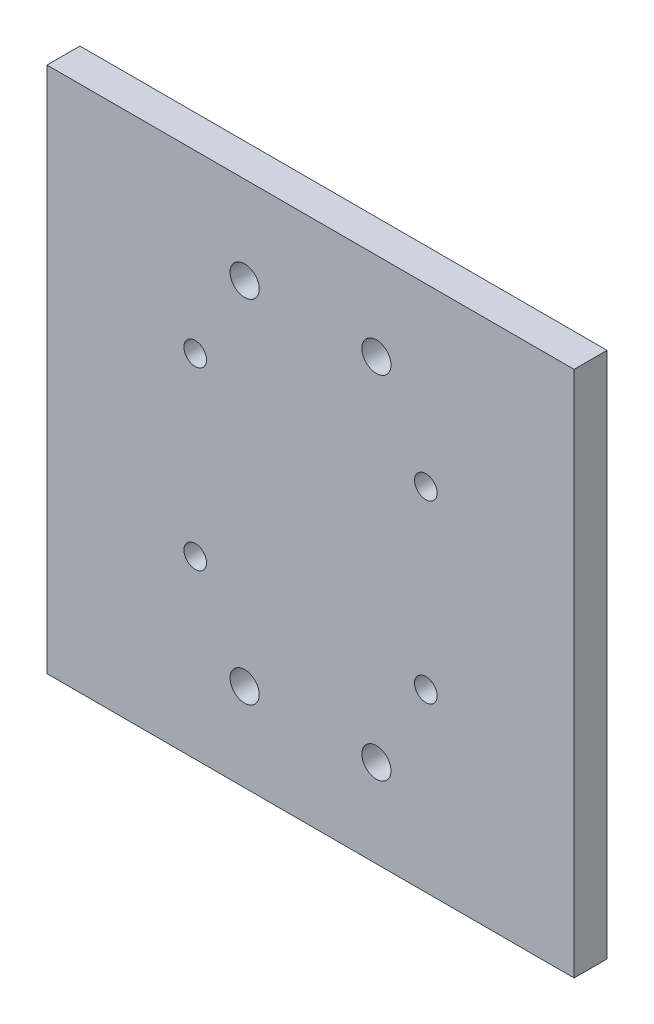
ISO-10303-21;
HEADER;
FILE_DESCRIPTION(('STEP AP214'),'2;1');
FILE_NAME('part.step','',(''),(''),'','','');
FILE_SCHEMA(('AUTOMOTIVE_DESIGN { 1 0 10303 214 1 1 1 1 }'));
ENDSEC;
DATA;
#1=APPLICATION_CONTEXT('core data for automotive mechanical design processes');
#2=APPLICATION_PROTOCOL_DEFINITION('international standard','automotive_design',2000,#1);
#3=PRODUCT_CONTEXT('',#1,'mechanical');
#4=PRODUCT('Part','Part','',(#3));
#5=PRODUCT_RELATED_PRODUCT_CATEGORY('part','',(#4));
#6=PRODUCT_DEFINITION_FORMATION('','',#4);
#7=PRODUCT_DEFINITION_CONTEXT('part definition',#1,'design');
#8=PRODUCT_DEFINITION('design','',#6,#7);
#9=PRODUCT_DEFINITION_SHAPE('','',#8);
#10=(LENGTH_UNIT() NAMED_UNIT(*) SI_UNIT(.MILLI.,.METRE.));
#11=(NAMED_UNIT(*) PLANE_ANGLE_UNIT() SI_UNIT($,.RADIAN.));
#12=(NAMED_UNIT(*) SI_UNIT($,.STERADIAN.) SOLID_ANGLE_UNIT());
#13=UNCERTAINTY_MEASURE_WITH_UNIT(LENGTH_MEASURE(1.E-05),#10,'distance_accuracy_value','');
#14=(GEOMETRIC_REPRESENTATION_CONTEXT(3) GLOBAL_UNCERTAINTY_ASSIGNED_CONTEXT((#13)) GLOBAL_UNIT_ASSIGNED_CONTEXT((#10,
#11,#12)) REPRESENTATION_CONTEXT('',''));
#15=CARTESIAN_POINT('',(0.,0.,0.));
#16=DIRECTION('',(0.,0.,1.));
#17=DIRECTION('',(1.,0.,0.));
#18=AXIS2_PLACEMENT_3D('',#15,#16,#17);
#19=CARTESIAN_POINT('',(0.,0.,9.525));
#20=DIRECTION('',(0.,0.,-1.));
#21=DIRECTION('',(-1.,0.,0.));
#22=AXIS2_PLACEMENT_3D('',#19,#20,#21);
#23=PLANE('',#22);
#24=CARTESIAN_POINT('',(95.25,127.,9.525));
#25=DIRECTION('',(0.,0.,1.));
#26=DIRECTION('',(1.,0.,0.));
#27=AXIS2_PLACEMENT_3D('',#24,#25,#26);
#28=CIRCLE('',#27,4.21639999999999);
#29=CARTESIAN_POINT('',(99.4664,127.,9.525));
#30=VERTEX_POINT('',#29);
#31=EDGE_CURVE('E157',#30,#30,#28,.T.);
#32=ORIENTED_EDGE('',*,*,#31,.F.);
#33=EDGE_LOOP('',(#32));
#34=FACE_BOUND('',#33,.T.);
#35=CARTESIAN_POINT('',(95.25,25.4,9.525));
#36=DIRECTION('',(0.,0.,1.));
#37=DIRECTION('',(1.,0.,0.));
#38=AXIS2_PLACEMENT_3D('',#35,#36,#37);
#39=CIRCLE('',#38,4.21639999999999);
#40=CARTESIAN_POINT('',(99.4664,25.4,9.525));
#41=VERTEX_POINT('',#40);
#42=EDGE_CURVE('E145',#41,#41,#39,.T.);
#43=ORIENTED_EDGE('',*,*,#42,.F.);
#44=EDGE_LOOP('',(#43));
#45=FACE_BOUND('',#44,.T.);
#46=CARTESIAN_POINT('',(57.15,25.4,9.525));
#47=DIRECTION('',(0.,0.,1.));
#48=DIRECTION('',(1.,0.,0.));
#49=AXIS2_PLACEMENT_3D('',#46,#47,#48);
#50=CIRCLE('',#49,4.21639999999999);
#51=CARTESIAN_POINT('',(61.3664,25.4,9.525));
#52=VERTEX_POINT('',#51);
#53=EDGE_CURVE('E139',#52,#52,#50,.T.);
#54=ORIENTED_EDGE('',*,*,#53,.F.);
#55=EDGE_LOOP('',(#54));
#56=FACE_BOUND('',#55,.T.);
#57=CARTESIAN_POINT('',(109.5375,101.6,9.525));
#58=DIRECTION('',(0.,0.,1.));
#59=DIRECTION('',(1.,0.,0.));
#60=AXIS2_PLACEMENT_3D('',#57,#58,#59);
#61=CIRCLE('',#60,3.2639);
#62=CARTESIAN_POINT('',(112.8014,101.6,9.525));
#63=VERTEX_POINT('',#62);
#64=EDGE_CURVE('E133',#63,#63,#61,.T.);
#65=ORIENTED_EDGE('',*,*,#64,.F.);
#66=EDGE_LOOP('',(#65));
#67=FACE_BOUND('',#66,.T.);
#68=CARTESIAN_POINT('',(42.8625,101.6,9.525));
#69=DIRECTION('',(0.,0.,1.));
#70=DIRECTION('',(1.,0.,0.));
#71=AXIS2_PLACEMENT_3D('',#68,#69,#70);
#72=CIRCLE('',#71,3.26389999999999);
#73=CARTESIAN_POINT('',(46.1264,101.6,9.525));
#74=VERTEX_POINT('',#73);
#75=EDGE_CURVE('E127',#74,#74,#72,.T.);
#76=ORIENTED_EDGE('',*,*,#75,.F.);
#77=EDGE_LOOP('',(#76));
#78=FACE_BOUND('',#77,.T.);
#79=CARTESIAN_POINT('',(109.5375,50.8,9.525));
#80=DIRECTION('',(0.,0.,1.));
#81=DIRECTION('',(1.,0.,0.));
#82=AXIS2_PLACEMENT_3D('',#79,#80,#81);
#83=CIRCLE('',#82,3.2639);
#84=CARTESIAN_POINT('',(112.8014,50.8,9.525));
#85=VERTEX_POINT('',#84);
#86=EDGE_CURVE('E121',#85,#85,#83,.T.);
#87=ORIENTED_EDGE('',*,*,#86,.F.);
#88=EDGE_LOOP('',(#87));
#89=FACE_BOUND('',#88,.T.);
#90=CARTESIAN_POINT('',(42.8625,50.8,9.525));
#91=DIRECTION('',(0.,0.,1.));
#92=DIRECTION('',(1.,0.,0.));
#93=AXIS2_PLACEMENT_3D('',#90,#91,#92);
#94=CIRCLE('',#93,3.26389999999999);
#95=CARTESIAN_POINT('',(46.1264,50.8,9.525));
#96=VERTEX_POINT('',#95);
#97=EDGE_CURVE('E115',#96,#96,#94,.T.);
#98=ORIENTED_EDGE('',*,*,#97,.F.);
#99=EDGE_LOOP('',(#98));
#100=FACE_BOUND('',#99,.T.);
#101=DIRECTION('',(0.,-1.,0.));
#102=VECTOR('',#101,1.);
#103=CARTESIAN_POINT('',(0.,0.,9.525));
#104=LINE('',#103,#102);
#105=CARTESIAN_POINT('',(0.,152.4,9.525));
#106=VERTEX_POINT('',#105);
#107=CARTESIAN_POINT('',(0.,0.,9.525));
#108=VERTEX_POINT('',#107);
#109=EDGE_CURVE('E87',#106,#108,#104,.T.);
#110=ORIENTED_EDGE('',*,*,#109,.T.);
#111=DIRECTION('',(1.,0.,0.));
#112=VECTOR('',#111,1.);
#113=CARTESIAN_POINT('',(0.,0.,9.525));
#114=LINE('',#113,#112);
#115=CARTESIAN_POINT('',(152.4,0.,9.525));
#116=VERTEX_POINT('',#115);
#117=EDGE_CURVE('E82',#108,#116,#114,.T.);
#118=ORIENTED_EDGE('',*,*,#117,.T.);
#119=DIRECTION('',(0.,1.,0.));
#120=VECTOR('',#119,1.);
#121=CARTESIAN_POINT('',(152.4,0.,9.525));
#122=LINE('',#121,#120);
#123=CARTESIAN_POINT('',(152.4,152.4,9.525));
#124=VERTEX_POINT('',#123);
#125=EDGE_CURVE('E85',#116,#124,#122,.T.);
#126=ORIENTED_EDGE('',*,*,#125,.T.);
#127=DIRECTION('',(-1.,0.,0.));
#128=VECTOR('',#127,1.);
#129=CARTESIAN_POINT('',(0.,152.4,9.525));
#130=LINE('',#129,#128);
#131=EDGE_CURVE('E52',#124,#106,#130,.T.);
#132=ORIENTED_EDGE('',*,*,#131,.T.);
#133=EDGE_LOOP('',(#110,#118,#126,#132));
#134=FACE_BOUND('',#133,.T.);
#135=CARTESIAN_POINT('',(57.15,127.,9.525));
#136=DIRECTION('',(0.,0.,1.));
#137=DIRECTION('',(1.,0.,0.));
#138=AXIS2_PLACEMENT_3D('',#135,#136,#137);
#139=CIRCLE('',#138,4.21639999999999);
#140=CARTESIAN_POINT('',(61.3664,127.,9.525));
#141=VERTEX_POINT('',#140);
#142=EDGE_CURVE('E151',#141,#141,#139,.T.);
#143=ORIENTED_EDGE('',*,*,#142,.F.);
#144=EDGE_LOOP('',(#143));
#145=FACE_BOUND('',#144,.T.);
#146=ADVANCED_FACE('F35',(#34,#45,#56,#67,#78,#89,#100,#134,#145),#23,.F.);
#147=CARTESIAN_POINT('',(0.,0.,9.525));
#148=DIRECTION('',(1.,0.,0.));
#149=DIRECTION('',(0.,0.,-1.));
#150=AXIS2_PLACEMENT_3D('',#147,#148,#149);
#151=PLANE('',#150);
#152=DIRECTION('',(0.,-1.,0.));
#153=VECTOR('',#152,1.);
#154=CARTESIAN_POINT('',(0.,0.,0.));
#155=LINE('',#154,#153);
#156=CARTESIAN_POINT('',(0.,152.4,0.));
#157=VERTEX_POINT('',#156);
#158=CARTESIAN_POINT('',(0.,0.,0.));
#159=VERTEX_POINT('',#158);
#160=EDGE_CURVE('E99',#157,#159,#155,.T.);
#161=ORIENTED_EDGE('',*,*,#160,.T.);
#162=DIRECTION('',(0.,0.,-1.));
#163=VECTOR('',#162,1.);
#164=CARTESIAN_POINT('',(0.,0.,9.525));
#165=LINE('',#164,#163);
#166=EDGE_CURVE('E11',#108,#159,#165,.T.);
#167=ORIENTED_EDGE('',*,*,#166,.F.);
#168=ORIENTED_EDGE('',*,*,#109,.F.);
#169=DIRECTION('',(0.,0.,-1.));
#170=VECTOR('',#169,1.);
#171=CARTESIAN_POINT('',(0.,152.4,9.525));
#172=LINE('',#171,#170);
#173=EDGE_CURVE('E95',#106,#157,#172,.T.);
#174=ORIENTED_EDGE('',*,*,#173,.T.);
#175=EDGE_LOOP('',(#161,#167,#168,#174));
#176=FACE_BOUND('',#175,.T.);
#177=ADVANCED_FACE('F37',(#176),#151,.F.);
#178=CARTESIAN_POINT('',(0.,0.,9.525));
#179=DIRECTION('',(0.,1.,0.));
#180=DIRECTION('',(0.,0.,1.));
#181=AXIS2_PLACEMENT_3D('',#178,#179,#180);
#182=PLANE('',#181);
#183=DIRECTION('',(1.,0.,0.));
#184=VECTOR('',#183,1.);
#185=CARTESIAN_POINT('',(0.,0.,0.));
#186=LINE('',#185,#184);
#187=CARTESIAN_POINT('',(152.4,0.,0.));
#188=VERTEX_POINT('',#187);
#189=EDGE_CURVE('E91',#159,#188,#186,.T.);
#190=ORIENTED_EDGE('',*,*,#189,.T.);
#191=DIRECTION('',(0.,0.,-1.));
#192=VECTOR('',#191,1.);
#193=CARTESIAN_POINT('',(152.4,0.,9.525));
#194=LINE('',#193,#192);
#195=EDGE_CURVE('E44',#116,#188,#194,.T.);
#196=ORIENTED_EDGE('',*,*,#195,.F.);
#197=ORIENTED_EDGE('',*,*,#117,.F.);
#198=ORIENTED_EDGE('',*,*,#166,.T.);
#199=EDGE_LOOP('',(#190,#196,#197,#198));
#200=FACE_BOUND('',#199,.T.);
#201=ADVANCED_FACE('F90',(#200),#182,.F.);
#202=CARTESIAN_POINT('',(152.4,0.,9.525));
#203=DIRECTION('',(-1.,0.,0.));
#204=DIRECTION('',(0.,0.,1.));
#205=AXIS2_PLACEMENT_3D('',#202,#203,#204);
#206=PLANE('',#205);
#207=DIRECTION('',(0.,1.,0.));
#208=VECTOR('',#207,1.);
#209=CARTESIAN_POINT('',(152.4,0.,0.));
#210=LINE('',#209,#208);
#211=CARTESIAN_POINT('',(152.4,152.4,0.));
#212=VERTEX_POINT('',#211);
#213=EDGE_CURVE('E69',#188,#212,#210,.T.);
#214=ORIENTED_EDGE('',*,*,#213,.T.);
#215=DIRECTION('',(0.,0.,-1.));
#216=VECTOR('',#215,1.);
#217=CARTESIAN_POINT('',(152.4,152.4,9.525));
#218=LINE('',#217,#216);
#219=EDGE_CURVE('E92',#124,#212,#218,.T.);
#220=ORIENTED_EDGE('',*,*,#219,.F.);
#221=ORIENTED_EDGE('',*,*,#125,.F.);
#222=ORIENTED_EDGE('',*,*,#195,.T.);
#223=EDGE_LOOP('',(#214,#220,#221,#222));
#224=FACE_BOUND('',#223,.T.);
#225=ADVANCED_FACE('F93',(#224),#206,.F.);
#226=CARTESIAN_POINT('',(0.,152.4,9.525));
#227=DIRECTION('',(0.,-1.,0.));
#228=DIRECTION('',(0.,0.,-1.));
#229=AXIS2_PLACEMENT_3D('',#226,#227,#228);
#230=PLANE('',#229);
#231=DIRECTION('',(-1.,0.,0.));
#232=VECTOR('',#231,1.);
#233=CARTESIAN_POINT('',(0.,152.4,0.));
#234=LINE('',#233,#232);
#235=EDGE_CURVE('E75',#212,#157,#234,.T.);
#236=ORIENTED_EDGE('',*,*,#235,.T.);
#237=ORIENTED_EDGE('',*,*,#173,.F.);
#238=ORIENTED_EDGE('',*,*,#131,.F.);
#239=ORIENTED_EDGE('',*,*,#219,.T.);
#240=EDGE_LOOP('',(#236,#237,#238,#239));
#241=FACE_BOUND('',#240,.T.);
#242=ADVANCED_FACE('F107',(#241),#230,.F.);
#243=CARTESIAN_POINT('',(0.,0.,0.));
#244=DIRECTION('',(0.,0.,-1.));
#245=DIRECTION('',(-1.,0.,0.));
#246=AXIS2_PLACEMENT_3D('',#243,#244,#245);
#247=PLANE('',#246);
#248=CARTESIAN_POINT('',(95.25,127.,0.));
#249=DIRECTION('',(0.,0.,1.));
#250=DIRECTION('',(1.,0.,0.));
#251=AXIS2_PLACEMENT_3D('',#248,#249,#250);
#252=CIRCLE('',#251,4.21639999999999);
#253=CARTESIAN_POINT('',(99.4664,127.,0.));
#254=VERTEX_POINT('',#253);
#255=EDGE_CURVE('E154',#254,#254,#252,.T.);
#256=ORIENTED_EDGE('',*,*,#255,.T.);
#257=EDGE_LOOP('',(#256));
#258=FACE_BOUND('',#257,.T.);
#259=CARTESIAN_POINT('',(57.15,127.,0.));
#260=DIRECTION('',(0.,0.,1.));
#261=DIRECTION('',(1.,0.,0.));
#262=AXIS2_PLACEMENT_3D('',#259,#260,#261);
#263=CIRCLE('',#262,4.21639999999999);
#264=CARTESIAN_POINT('',(61.3664,127.,0.));
#265=VERTEX_POINT('',#264);
#266=EDGE_CURVE('E148',#265,#265,#263,.T.);
#267=ORIENTED_EDGE('',*,*,#266,.T.);
#268=EDGE_LOOP('',(#267));
#269=FACE_BOUND('',#268,.T.);
#270=CARTESIAN_POINT('',(95.25,25.4,0.));
#271=DIRECTION('',(0.,0.,1.));
#272=DIRECTION('',(1.,0.,0.));
#273=AXIS2_PLACEMENT_3D('',#270,#271,#272);
#274=CIRCLE('',#273,4.21639999999999);
#275=CARTESIAN_POINT('',(99.4664,25.4,0.));
#276=VERTEX_POINT('',#275);
#277=EDGE_CURVE('E142',#276,#276,#274,.T.);
#278=ORIENTED_EDGE('',*,*,#277,.T.);
#279=EDGE_LOOP('',(#278));
#280=FACE_BOUND('',#279,.T.);
#281=CARTESIAN_POINT('',(57.15,25.4,0.));
#282=DIRECTION('',(0.,0.,1.));
#283=DIRECTION('',(1.,0.,0.));
#284=AXIS2_PLACEMENT_3D('',#281,#282,#283);
#285=CIRCLE('',#284,4.21639999999999);
#286=CARTESIAN_POINT('',(61.3664,25.4,0.));
#287=VERTEX_POINT('',#286);
#288=EDGE_CURVE('E136',#287,#287,#285,.T.);
#289=ORIENTED_EDGE('',*,*,#288,.T.);
#290=EDGE_LOOP('',(#289));
#291=FACE_BOUND('',#290,.T.);
#292=CARTESIAN_POINT('',(109.5375,101.6,0.));
#293=DIRECTION('',(0.,0.,1.));
#294=DIRECTION('',(1.,0.,0.));
#295=AXIS2_PLACEMENT_3D('',#292,#293,#294);
#296=CIRCLE('',#295,3.2639);
#297=CARTESIAN_POINT('',(112.8014,101.6,0.));
#298=VERTEX_POINT('',#297);
#299=EDGE_CURVE('E130',#298,#298,#296,.T.);
#300=ORIENTED_EDGE('',*,*,#299,.T.);
#301=EDGE_LOOP('',(#300));
#302=FACE_BOUND('',#301,.T.);
#303=CARTESIAN_POINT('',(42.8625,101.6,0.));
#304=DIRECTION('',(0.,0.,1.));
#305=DIRECTION('',(1.,0.,0.));
#306=AXIS2_PLACEMENT_3D('',#303,#304,#305);
#307=CIRCLE('',#306,3.26389999999999);
#308=CARTESIAN_POINT('',(46.1264,101.6,0.));
#309=VERTEX_POINT('',#308);
#310=EDGE_CURVE('E124',#309,#309,#307,.T.);
#311=ORIENTED_EDGE('',*,*,#310,.T.);
#312=EDGE_LOOP('',(#311));
#313=FACE_BOUND('',#312,.T.);
#314=CARTESIAN_POINT('',(109.5375,50.8,0.));
#315=DIRECTION('',(0.,0.,1.));
#316=DIRECTION('',(1.,0.,0.));
#317=AXIS2_PLACEMENT_3D('',#314,#315,#316);
#318=CIRCLE('',#317,3.2639);
#319=CARTESIAN_POINT('',(112.8014,50.8,0.));
#320=VERTEX_POINT('',#319);
#321=EDGE_CURVE('E118',#320,#320,#318,.T.);
#322=ORIENTED_EDGE('',*,*,#321,.T.);
#323=EDGE_LOOP('',(#322));
#324=FACE_BOUND('',#323,.T.);
#325=CARTESIAN_POINT('',(42.8625,50.8,0.));
#326=DIRECTION('',(0.,0.,1.));
#327=DIRECTION('',(1.,0.,0.));
#328=AXIS2_PLACEMENT_3D('',#325,#326,#327);
#329=CIRCLE('',#328,3.26389999999999);
#330=CARTESIAN_POINT('',(46.1264,50.8,0.));
#331=VERTEX_POINT('',#330);
#332=EDGE_CURVE('E102',#331,#331,#329,.T.);
#333=ORIENTED_EDGE('',*,*,#332,.T.);
#334=EDGE_LOOP('',(#333));
#335=FACE_BOUND('',#334,.T.);
#336=ORIENTED_EDGE('',*,*,#160,.F.);
#337=ORIENTED_EDGE('',*,*,#235,.F.);
#338=ORIENTED_EDGE('',*,*,#213,.F.);
#339=ORIENTED_EDGE('',*,*,#189,.F.);
#340=EDGE_LOOP('',(#336,#337,#338,#339));
#341=FACE_BOUND('',#340,.T.);
#342=ADVANCED_FACE('F110',(#258,#269,#280,#291,#302,#313,#324,#335,#341),#247,.T.);
#343=CARTESIAN_POINT('',(42.8625,50.8,9.525));
#344=DIRECTION('',(0.,0.,1.));
#345=DIRECTION('',(1.,0.,0.));
#346=AXIS2_PLACEMENT_3D('',#343,#344,#345);
#347=CYLINDRICAL_SURFACE('',#346,3.26389999999999);
#348=ORIENTED_EDGE('',*,*,#332,.F.);
#349=EDGE_LOOP('',(#348));
#350=FACE_BOUND('',#349,.T.);
#351=ORIENTED_EDGE('',*,*,#97,.T.);
#352=EDGE_LOOP('',(#351));
#353=FACE_BOUND('',#352,.T.);
#354=ADVANCED_FACE('F178',(#350,#353),#347,.F.);
#355=CARTESIAN_POINT('',(109.5375,50.8,9.525));
#356=DIRECTION('',(0.,0.,1.));
#357=DIRECTION('',(1.,0.,0.));
#358=AXIS2_PLACEMENT_3D('',#355,#356,#357);
#359=CYLINDRICAL_SURFACE('',#358,3.2639);
#360=ORIENTED_EDGE('',*,*,#321,.F.);
#361=EDGE_LOOP('',(#360));
#362=FACE_BOUND('',#361,.T.);
#363=ORIENTED_EDGE('',*,*,#86,.T.);
#364=EDGE_LOOP('',(#363));
#365=FACE_BOUND('',#364,.T.);
#366=ADVANCED_FACE('F180',(#362,#365),#359,.F.);
#367=CARTESIAN_POINT('',(42.8625,101.6,9.525));
#368=DIRECTION('',(0.,0.,1.));
#369=DIRECTION('',(1.,0.,0.));
#370=AXIS2_PLACEMENT_3D('',#367,#368,#369);
#371=CYLINDRICAL_SURFACE('',#370,3.26389999999999);
#372=ORIENTED_EDGE('',*,*,#310,.F.);
#373=EDGE_LOOP('',(#372));
#374=FACE_BOUND('',#373,.T.);
#375=ORIENTED_EDGE('',*,*,#75,.T.);
#376=EDGE_LOOP('',(#375));
#377=FACE_BOUND('',#376,.T.);
#378=ADVANCED_FACE('F187',(#374,#377),#371,.F.);
#379=CARTESIAN_POINT('',(109.5375,101.6,9.525));
#380=DIRECTION('',(0.,0.,1.));
#381=DIRECTION('',(1.,0.,0.));
#382=AXIS2_PLACEMENT_3D('',#379,#380,#381);
#383=CYLINDRICAL_SURFACE('',#382,3.2639);
#384=ORIENTED_EDGE('',*,*,#299,.F.);
#385=EDGE_LOOP('',(#384));
#386=FACE_BOUND('',#385,.T.);
#387=ORIENTED_EDGE('',*,*,#64,.T.);
#388=EDGE_LOOP('',(#387));
#389=FACE_BOUND('',#388,.T.);
#390=ADVANCED_FACE('F246',(#386,#389),#383,.F.);
#391=CARTESIAN_POINT('',(57.15,25.4,9.525));
#392=DIRECTION('',(0.,0.,1.));
#393=DIRECTION('',(1.,0.,0.));
#394=AXIS2_PLACEMENT_3D('',#391,#392,#393);
#395=CYLINDRICAL_SURFACE('',#394,4.21639999999999);
#396=ORIENTED_EDGE('',*,*,#288,.F.);
#397=EDGE_LOOP('',(#396));
#398=FACE_BOUND('',#397,.T.);
#399=ORIENTED_EDGE('',*,*,#53,.T.);
#400=EDGE_LOOP('',(#399));
#401=FACE_BOUND('',#400,.T.);
#402=ADVANCED_FACE('F255',(#398,#401),#395,.F.);
#403=CARTESIAN_POINT('',(95.25,25.4,9.525));
#404=DIRECTION('',(0.,0.,1.));
#405=DIRECTION('',(1.,0.,0.));
#406=AXIS2_PLACEMENT_3D('',#403,#404,#405);
#407=CYLINDRICAL_SURFACE('',#406,4.21639999999999);
#408=ORIENTED_EDGE('',*,*,#277,.F.);
#409=EDGE_LOOP('',(#408));
#410=FACE_BOUND('',#409,.T.);
#411=ORIENTED_EDGE('',*,*,#42,.T.);
#412=EDGE_LOOP('',(#411));
#413=FACE_BOUND('',#412,.T.);
#414=ADVANCED_FACE('F272',(#410,#413),#407,.F.);
#415=CARTESIAN_POINT('',(57.15,127.,9.525));
#416=DIRECTION('',(0.,0.,1.));
#417=DIRECTION('',(1.,0.,0.));
#418=AXIS2_PLACEMENT_3D('',#415,#416,#417);
#419=CYLINDRICAL_SURFACE('',#418,4.21639999999999);
#420=ORIENTED_EDGE('',*,*,#266,.F.);
#421=EDGE_LOOP('',(#420));
#422=FACE_BOUND('',#421,.T.);
#423=ORIENTED_EDGE('',*,*,#142,.T.);
#424=EDGE_LOOP('',(#423));
#425=FACE_BOUND('',#424,.T.);
#426=ADVANCED_FACE('F282',(#422,#425),#419,.F.);
#427=CARTESIAN_POINT('',(95.25,127.,9.525));
#428=DIRECTION('',(0.,0.,1.));
#429=DIRECTION('',(1.,0.,0.));
#430=AXIS2_PLACEMENT_3D('',#427,#428,#429);
#431=CYLINDRICAL_SURFACE('',#430,4.21639999999999);
#432=ORIENTED_EDGE('',*,*,#255,.F.);
#433=EDGE_LOOP('',(#432));
#434=FACE_BOUND('',#433,.T.);
#435=ORIENTED_EDGE('',*,*,#31,.T.);
#436=EDGE_LOOP('',(#435));
#437=FACE_BOUND('',#436,.T.);
#438=ADVANCED_FACE('F161',(#434,#437),#431,.F.);
#439=CLOSED_SHELL('',(#146,#177,#201,#225,#242,#342,#354,#366,#378,#390,#402,#414,#426,#438));
#440=MANIFOLD_SOLID_BREP('B2',#439);
#441=ADVANCED_BREP_SHAPE_REPRESENTATION('',(#18,#440),#14);
#442=SHAPE_DEFINITION_REPRESENTATION(#9,#441);
ENDSEC;
END-ISO-10303-21;
